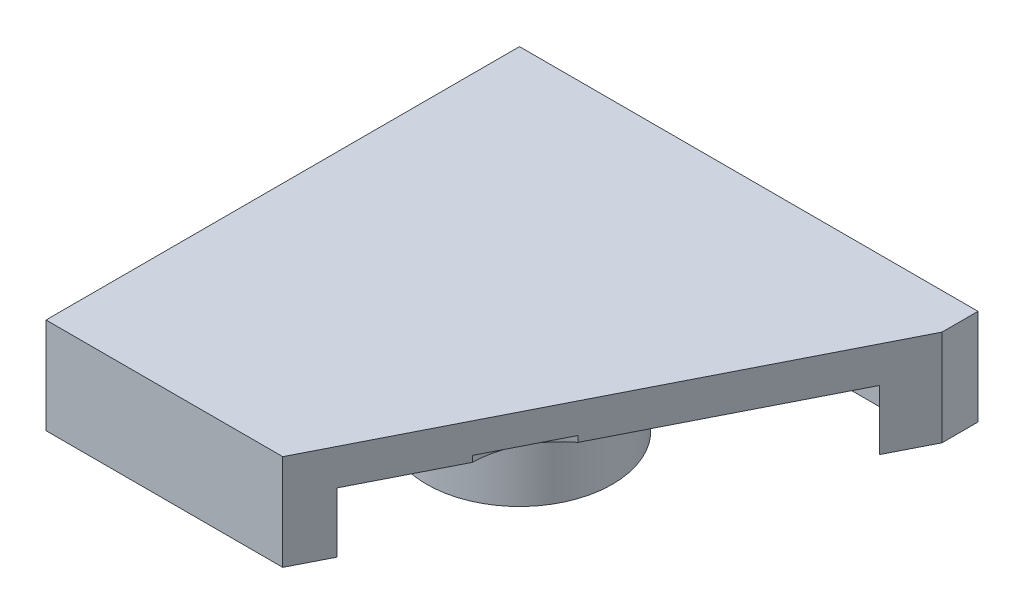
ISO-10303-21;
HEADER;
FILE_DESCRIPTION(('STEP AP214'),'2;1');
FILE_NAME('part.step','',(''),(''),'','','');
FILE_SCHEMA(('AUTOMOTIVE_DESIGN { 1 0 10303 214 1 1 1 1 }'));
ENDSEC;
DATA;
#1=APPLICATION_CONTEXT('core data for automotive mechanical design processes');
#2=APPLICATION_PROTOCOL_DEFINITION('international standard','automotive_design',2000,#1);
#3=PRODUCT_CONTEXT('',#1,'mechanical');
#4=PRODUCT('Part','Part','',(#3));
#5=PRODUCT_RELATED_PRODUCT_CATEGORY('part','',(#4));
#6=PRODUCT_DEFINITION_FORMATION('','',#4);
#7=PRODUCT_DEFINITION_CONTEXT('part definition',#1,'design');
#8=PRODUCT_DEFINITION('design','',#6,#7);
#9=PRODUCT_DEFINITION_SHAPE('','',#8);
#10=(LENGTH_UNIT() NAMED_UNIT(*) SI_UNIT(.MILLI.,.METRE.));
#11=(NAMED_UNIT(*) PLANE_ANGLE_UNIT() SI_UNIT($,.RADIAN.));
#12=(NAMED_UNIT(*) SI_UNIT($,.STERADIAN.) SOLID_ANGLE_UNIT());
#13=UNCERTAINTY_MEASURE_WITH_UNIT(LENGTH_MEASURE(1.E-05),#10,'distance_accuracy_value','');
#14=(GEOMETRIC_REPRESENTATION_CONTEXT(3) GLOBAL_UNCERTAINTY_ASSIGNED_CONTEXT((#13)) GLOBAL_UNIT_ASSIGNED_CONTEXT((#10,
#11,#12)) REPRESENTATION_CONTEXT('',''));
#15=CARTESIAN_POINT('',(0.,0.,0.));
#16=DIRECTION('',(0.,0.,1.));
#17=DIRECTION('',(1.,0.,0.));
#18=AXIS2_PLACEMENT_3D('',#15,#16,#17);
#19=CARTESIAN_POINT('',(0.681967213114738,0.,7.9));
#20=DIRECTION('',(0.,1.,0.));
#21=DIRECTION('',(0.,0.,1.));
#22=AXIS2_PLACEMENT_3D('',#19,#20,#21);
#23=PLANE('',#22);
#24=DIRECTION('',(1.,0.,0.));
#25=VECTOR('',#24,1.);
#26=CARTESIAN_POINT('',(0.681967213114738,0.,-7.9));
#27=LINE('',#26,#25);
#28=CARTESIAN_POINT('',(0.681967213114738,0.,-7.9));
#29=VERTEX_POINT('',#28);
#30=CARTESIAN_POINT('',(15.9819672131147,0.,-7.9));
#31=VERTEX_POINT('',#30);
#32=EDGE_CURVE('E220',#29,#31,#27,.T.);
#33=ORIENTED_EDGE('',*,*,#32,.T.);
#34=DIRECTION('',(0.,0.,-1.));
#35=VECTOR('',#34,1.);
#36=CARTESIAN_POINT('',(15.9819672131147,0.,-6.7));
#37=LINE('',#36,#35);
#38=CARTESIAN_POINT('',(15.9819672131147,0.,-6.7));
#39=VERTEX_POINT('',#38);
#40=EDGE_CURVE('E156',#39,#31,#37,.T.);
#41=ORIENTED_EDGE('',*,*,#40,.F.);
#42=DIRECTION('',(0.452094425934652,0.,-0.8919700836008));
#43=VECTOR('',#42,1.);
#44=CARTESIAN_POINT('',(8.74651880010872,0.,7.57534416620106));
#45=LINE('',#44,#43);
#46=CARTESIAN_POINT('',(15.2819672131147,0.,-5.31891891891892));
#47=VERTEX_POINT('',#46);
#48=EDGE_CURVE('E148',#47,#39,#45,.T.);
#49=ORIENTED_EDGE('',*,*,#48,.F.);
#50=DIRECTION('',(0.,0.,-1.));
#51=VECTOR('',#50,1.);
#52=CARTESIAN_POINT('',(15.2819672131147,0.,7.9));
#53=LINE('',#52,#51);
#54=CARTESIAN_POINT('',(15.2819672131147,0.,-6.7));
#55=VERTEX_POINT('',#54);
#56=EDGE_CURVE('E197',#47,#55,#53,.T.);
#57=ORIENTED_EDGE('',*,*,#56,.T.);
#58=DIRECTION('',(1.,0.,0.));
#59=VECTOR('',#58,1.);
#60=CARTESIAN_POINT('',(0.,0.,-6.7));
#61=LINE('',#60,#59);
#62=CARTESIAN_POINT('',(1.88196721311474,0.,-6.7));
#63=VERTEX_POINT('',#62);
#64=EDGE_CURVE('E183',#63,#55,#61,.T.);
#65=ORIENTED_EDGE('',*,*,#64,.F.);
#66=DIRECTION('',(0.,0.,-1.));
#67=VECTOR('',#66,1.);
#68=CARTESIAN_POINT('',(1.88196721311474,0.,7.9));
#69=LINE('',#68,#67);
#70=CARTESIAN_POINT('',(1.88196721311474,0.,6.7));
#71=VERTEX_POINT('',#70);
#72=EDGE_CURVE('E200',#71,#63,#69,.T.);
#73=ORIENTED_EDGE('',*,*,#72,.F.);
#74=DIRECTION('',(1.,0.,0.));
#75=VECTOR('',#74,1.);
#76=CARTESIAN_POINT('',(0.,0.,6.7));
#77=LINE('',#76,#75);
#78=CARTESIAN_POINT('',(9.19018639119693,0.,6.7));
#79=VERTEX_POINT('',#78);
#80=EDGE_CURVE('E186',#71,#79,#77,.T.);
#81=ORIENTED_EDGE('',*,*,#80,.T.);
#82=CARTESIAN_POINT('',(8.58196721311474,0.,7.9));
#83=VERTEX_POINT('',#82);
#84=EDGE_CURVE('E66',#83,#79,#45,.T.);
#85=ORIENTED_EDGE('',*,*,#84,.F.);
#86=DIRECTION('',(1.,0.,0.));
#87=VECTOR('',#86,1.);
#88=CARTESIAN_POINT('',(0.681967213114738,0.,7.9));
#89=LINE('',#88,#87);
#90=CARTESIAN_POINT('',(0.681967213114738,0.,7.9));
#91=VERTEX_POINT('',#90);
#92=EDGE_CURVE('E211',#91,#83,#89,.T.);
#93=ORIENTED_EDGE('',*,*,#92,.F.);
#94=DIRECTION('',(0.,0.,-1.));
#95=VECTOR('',#94,1.);
#96=CARTESIAN_POINT('',(0.681967213114738,0.,7.9));
#97=LINE('',#96,#95);
#98=EDGE_CURVE('E226',#91,#29,#97,.T.);
#99=ORIENTED_EDGE('',*,*,#98,.T.);
#100=EDGE_LOOP('',(#33,#41,#49,#57,#65,#73,#81,#85,#93,#99));
#101=FACE_BOUND('',#100,.T.);
#102=ADVANCED_FACE('F45',(#101),#23,.F.);
#103=CARTESIAN_POINT('',(0.681967213114738,0.,7.9));
#104=DIRECTION('',(1.,0.,0.));
#105=DIRECTION('',(0.,0.,-1.));
#106=AXIS2_PLACEMENT_3D('',#103,#104,#105);
#107=PLANE('',#106);
#108=DIRECTION('',(0.,-1.,0.));
#109=VECTOR('',#108,1.);
#110=CARTESIAN_POINT('',(0.681967213114738,0.,-7.9));
#111=LINE('',#110,#109);
#112=CARTESIAN_POINT('',(0.681967213114738,3.2,-7.9));
#113=VERTEX_POINT('',#112);
#114=EDGE_CURVE('E202',#113,#29,#111,.T.);
#115=ORIENTED_EDGE('',*,*,#114,.T.);
#116=ORIENTED_EDGE('',*,*,#98,.F.);
#117=DIRECTION('',(0.,-1.,0.));
#118=VECTOR('',#117,1.);
#119=CARTESIAN_POINT('',(0.681967213114738,0.,7.9));
#120=LINE('',#119,#118);
#121=CARTESIAN_POINT('',(0.681967213114738,3.2,7.9));
#122=VERTEX_POINT('',#121);
#123=EDGE_CURVE('E208',#122,#91,#120,.T.);
#124=ORIENTED_EDGE('',*,*,#123,.F.);
#125=DIRECTION('',(0.,0.,-1.));
#126=VECTOR('',#125,1.);
#127=CARTESIAN_POINT('',(0.681967213114738,3.2,7.9));
#128=LINE('',#127,#126);
#129=EDGE_CURVE('E217',#122,#113,#128,.T.);
#130=ORIENTED_EDGE('',*,*,#129,.T.);
#131=EDGE_LOOP('',(#115,#116,#124,#130));
#132=FACE_BOUND('',#131,.T.);
#133=ADVANCED_FACE('F47',(#132),#107,.F.);
#134=CARTESIAN_POINT('',(0.681967213114738,3.2,7.9));
#135=DIRECTION('',(0.,-1.,0.));
#136=DIRECTION('',(1.,0.,0.));
#137=AXIS2_PLACEMENT_3D('',#134,#135,#136);
#138=PLANE('',#137);
#139=DIRECTION('',(0.452094425934655,0.,-0.891970083600798));
#140=VECTOR('',#139,1.);
#141=CARTESIAN_POINT('',(8.74651880010872,3.2,7.57534416620106));
#142=LINE('',#141,#140);
#143=CARTESIAN_POINT('',(8.58196721311474,3.2,7.9));
#144=VERTEX_POINT('',#143);
#145=CARTESIAN_POINT('',(15.9819672131147,3.2,-6.7));
#146=VERTEX_POINT('',#145);
#147=EDGE_CURVE('E152',#144,#146,#142,.T.);
#148=ORIENTED_EDGE('',*,*,#147,.T.);
#149=DIRECTION('',(0.,0.,-1.));
#150=VECTOR('',#149,1.);
#151=CARTESIAN_POINT('',(15.9819672131147,3.2,-6.7));
#152=LINE('',#151,#150);
#153=CARTESIAN_POINT('',(15.9819672131147,3.2,-7.9));
#154=VERTEX_POINT('',#153);
#155=EDGE_CURVE('E155',#146,#154,#152,.T.);
#156=ORIENTED_EDGE('',*,*,#155,.T.);
#157=DIRECTION('',(-1.,0.,0.));
#158=VECTOR('',#157,1.);
#159=CARTESIAN_POINT('',(0.681967213114738,3.2,-7.9));
#160=LINE('',#159,#158);
#161=EDGE_CURVE('E212',#154,#113,#160,.T.);
#162=ORIENTED_EDGE('',*,*,#161,.T.);
#163=ORIENTED_EDGE('',*,*,#129,.F.);
#164=DIRECTION('',(-1.,0.,0.));
#165=VECTOR('',#164,1.);
#166=CARTESIAN_POINT('',(0.681967213114738,3.2,7.9));
#167=LINE('',#166,#165);
#168=EDGE_CURVE('E215',#144,#122,#167,.T.);
#169=ORIENTED_EDGE('',*,*,#168,.F.);
#170=EDGE_LOOP('',(#148,#156,#162,#163,#169));
#171=FACE_BOUND('',#170,.T.);
#172=ADVANCED_FACE('F268',(#171),#138,.F.);
#173=CARTESIAN_POINT('',(0.,0.,7.9));
#174=DIRECTION('',(0.,0.,-1.));
#175=DIRECTION('',(-1.,0.,0.));
#176=AXIS2_PLACEMENT_3D('',#173,#174,#175);
#177=PLANE('',#176);
#178=ORIENTED_EDGE('',*,*,#92,.T.);
#179=DIRECTION('',(0.,-1.,0.));
#180=VECTOR('',#179,1.);
#181=CARTESIAN_POINT('',(8.58196721311474,3.2,7.9));
#182=LINE('',#181,#180);
#183=EDGE_CURVE('E162',#144,#83,#182,.T.);
#184=ORIENTED_EDGE('',*,*,#183,.F.);
#185=ORIENTED_EDGE('',*,*,#168,.T.);
#186=ORIENTED_EDGE('',*,*,#123,.T.);
#187=EDGE_LOOP('',(#178,#184,#185,#186));
#188=FACE_BOUND('',#187,.T.);
#189=ADVANCED_FACE('F273',(#188),#177,.F.);
#190=CARTESIAN_POINT('',(0.,0.,-7.9));
#191=DIRECTION('',(0.,0.,-1.));
#192=DIRECTION('',(-1.,0.,0.));
#193=AXIS2_PLACEMENT_3D('',#190,#191,#192);
#194=PLANE('',#193);
#195=DIRECTION('',(0.,-1.,0.));
#196=VECTOR('',#195,1.);
#197=CARTESIAN_POINT('',(15.9819672131147,3.2,-7.9));
#198=LINE('',#197,#196);
#199=EDGE_CURVE('E165',#154,#31,#198,.T.);
#200=ORIENTED_EDGE('',*,*,#199,.T.);
#201=ORIENTED_EDGE('',*,*,#32,.F.);
#202=ORIENTED_EDGE('',*,*,#114,.F.);
#203=ORIENTED_EDGE('',*,*,#161,.F.);
#204=EDGE_LOOP('',(#200,#201,#202,#203));
#205=FACE_BOUND('',#204,.T.);
#206=ADVANCED_FACE('F275',(#205),#194,.T.);
#207=CARTESIAN_POINT('',(1.88196721311474,0.,7.9));
#208=DIRECTION('',(1.,0.,0.));
#209=DIRECTION('',(0.,0.,-1.));
#210=AXIS2_PLACEMENT_3D('',#207,#208,#209);
#211=PLANE('',#210);
#212=DIRECTION('',(0.,-1.,0.));
#213=VECTOR('',#212,1.);
#214=CARTESIAN_POINT('',(1.88196721311474,0.,-6.7));
#215=LINE('',#214,#213);
#216=CARTESIAN_POINT('',(1.88196721311474,2.,-6.7));
#217=VERTEX_POINT('',#216);
#218=EDGE_CURVE('E180',#217,#63,#215,.T.);
#219=ORIENTED_EDGE('',*,*,#218,.F.);
#220=DIRECTION('',(0.,0.,-1.));
#221=VECTOR('',#220,1.);
#222=CARTESIAN_POINT('',(1.88196721311474,2.,7.9));
#223=LINE('',#222,#221);
#224=CARTESIAN_POINT('',(1.88196721311474,2.,6.7));
#225=VERTEX_POINT('',#224);
#226=EDGE_CURVE('E188',#225,#217,#223,.T.);
#227=ORIENTED_EDGE('',*,*,#226,.F.);
#228=DIRECTION('',(0.,-1.,0.));
#229=VECTOR('',#228,1.);
#230=CARTESIAN_POINT('',(1.88196721311474,0.,6.7));
#231=LINE('',#230,#229);
#232=EDGE_CURVE('E184',#225,#71,#231,.T.);
#233=ORIENTED_EDGE('',*,*,#232,.T.);
#234=ORIENTED_EDGE('',*,*,#72,.T.);
#235=EDGE_LOOP('',(#219,#227,#233,#234));
#236=FACE_BOUND('',#235,.T.);
#237=ADVANCED_FACE('F278',(#236),#211,.T.);
#238=CARTESIAN_POINT('',(15.2819672131147,0.,7.9));
#239=DIRECTION('',(-1.,0.,0.));
#240=DIRECTION('',(0.,0.,1.));
#241=AXIS2_PLACEMENT_3D('',#238,#239,#240);
#242=PLANE('',#241);
#243=DIRECTION('',(0.,-1.,0.));
#244=VECTOR('',#243,1.);
#245=CARTESIAN_POINT('',(15.2819672131147,0.,-5.31891891891892));
#246=LINE('',#245,#244);
#247=CARTESIAN_POINT('',(15.2819672131147,2.,-5.31891891891892));
#248=VERTEX_POINT('',#247);
#249=EDGE_CURVE('E171',#248,#47,#246,.T.);
#250=ORIENTED_EDGE('',*,*,#249,.F.);
#251=DIRECTION('',(0.,0.,-1.));
#252=VECTOR('',#251,1.);
#253=CARTESIAN_POINT('',(15.2819672131147,2.,7.9));
#254=LINE('',#253,#252);
#255=CARTESIAN_POINT('',(15.2819672131147,2.,-6.7));
#256=VERTEX_POINT('',#255);
#257=EDGE_CURVE('E191',#248,#256,#254,.T.);
#258=ORIENTED_EDGE('',*,*,#257,.T.);
#259=DIRECTION('',(0.,1.,0.));
#260=VECTOR('',#259,1.);
#261=CARTESIAN_POINT('',(15.2819672131147,0.,-6.7));
#262=LINE('',#261,#260);
#263=EDGE_CURVE('E194',#55,#256,#262,.T.);
#264=ORIENTED_EDGE('',*,*,#263,.F.);
#265=ORIENTED_EDGE('',*,*,#56,.F.);
#266=EDGE_LOOP('',(#250,#258,#264,#265));
#267=FACE_BOUND('',#266,.T.);
#268=ADVANCED_FACE('F291',(#267),#242,.T.);
#269=CARTESIAN_POINT('',(0.681967213114738,2.,7.9));
#270=DIRECTION('',(0.,-1.,0.));
#271=DIRECTION('',(1.,0.,0.));
#272=AXIS2_PLACEMENT_3D('',#269,#270,#271);
#273=PLANE('',#272);
#274=CARTESIAN_POINT('',(13.7107424714246,2.,3.74883214762885));
#275=DIRECTION('',(0.,-1.,0.));
#276=DIRECTION('',(1.,0.,0.));
#277=AXIS2_PLACEMENT_3D('',#274,#275,#276);
#278=CIRCLE('',#277,3.);
#279=CARTESIAN_POINT('',(10.7111535048734,2.,3.69917299193567));
#280=VERTEX_POINT('',#279);
#281=CARTESIAN_POINT('',(11.8972711267549,2.,1.35899498119637));
#282=VERTEX_POINT('',#281);
#283=EDGE_CURVE('E146',#280,#282,#278,.T.);
#284=ORIENTED_EDGE('',*,*,#283,.F.);
#285=DIRECTION('',(0.452094425934652,0.,-0.8919700836008));
#286=VECTOR('',#285,1.);
#287=CARTESIAN_POINT('',(6.9672911904214,2.,11.0857121528815));
#288=LINE('',#287,#286);
#289=CARTESIAN_POINT('',(9.19018639119693,2.,6.7));
#290=VERTEX_POINT('',#289);
#291=EDGE_CURVE('E145',#290,#280,#288,.T.);
#292=ORIENTED_EDGE('',*,*,#291,.F.);
#293=DIRECTION('',(-1.,0.,0.));
#294=VECTOR('',#293,1.);
#295=CARTESIAN_POINT('',(0.,2.,6.7));
#296=LINE('',#295,#294);
#297=EDGE_CURVE('E192',#290,#225,#296,.T.);
#298=ORIENTED_EDGE('',*,*,#297,.T.);
#299=ORIENTED_EDGE('',*,*,#226,.T.);
#300=DIRECTION('',(-1.,0.,0.));
#301=VECTOR('',#300,1.);
#302=CARTESIAN_POINT('',(0.,2.,-6.7));
#303=LINE('',#302,#301);
#304=EDGE_CURVE('E187',#256,#217,#303,.T.);
#305=ORIENTED_EDGE('',*,*,#304,.F.);
#306=ORIENTED_EDGE('',*,*,#257,.F.);
#307=EDGE_CURVE('E164',#282,#248,#288,.T.);
#308=ORIENTED_EDGE('',*,*,#307,.F.);
#309=EDGE_LOOP('',(#284,#292,#298,#299,#305,#306,#308));
#310=FACE_BOUND('',#309,.T.);
#311=CARTESIAN_POINT('',(8.58196721311474,2.,0.));
#312=DIRECTION('',(0.,-1.,0.));
#313=DIRECTION('',(1.,0.,0.));
#314=AXIS2_PLACEMENT_3D('',#311,#312,#313);
#315=CIRCLE('',#314,3.1);
#316=CARTESIAN_POINT('',(11.6819672131147,2.,0.));
#317=VERTEX_POINT('',#316);
#318=EDGE_CURVE('E179',#317,#317,#315,.F.);
#319=ORIENTED_EDGE('',*,*,#318,.T.);
#320=EDGE_LOOP('',(#319));
#321=FACE_BOUND('',#320,.T.);
#322=ADVANCED_FACE('F233',(#310,#321),#273,.T.);
#323=CARTESIAN_POINT('',(0.,0.,6.7));
#324=DIRECTION('',(0.,0.,-1.));
#325=DIRECTION('',(-1.,0.,0.));
#326=AXIS2_PLACEMENT_3D('',#323,#324,#325);
#327=PLANE('',#326);
#328=DIRECTION('',(0.,1.,0.));
#329=VECTOR('',#328,1.);
#330=CARTESIAN_POINT('',(9.19018639119693,0.,6.7));
#331=LINE('',#330,#329);
#332=EDGE_CURVE('E11',#79,#290,#331,.T.);
#333=ORIENTED_EDGE('',*,*,#332,.F.);
#334=ORIENTED_EDGE('',*,*,#80,.F.);
#335=ORIENTED_EDGE('',*,*,#232,.F.);
#336=ORIENTED_EDGE('',*,*,#297,.F.);
#337=EDGE_LOOP('',(#333,#334,#335,#336));
#338=FACE_BOUND('',#337,.T.);
#339=ADVANCED_FACE('F285',(#338),#327,.T.);
#340=CARTESIAN_POINT('',(0.,0.,-6.7));
#341=DIRECTION('',(0.,0.,-1.));
#342=DIRECTION('',(-1.,0.,0.));
#343=AXIS2_PLACEMENT_3D('',#340,#341,#342);
#344=PLANE('',#343);
#345=ORIENTED_EDGE('',*,*,#218,.T.);
#346=ORIENTED_EDGE('',*,*,#64,.T.);
#347=ORIENTED_EDGE('',*,*,#263,.T.);
#348=ORIENTED_EDGE('',*,*,#304,.T.);
#349=EDGE_LOOP('',(#345,#346,#347,#348));
#350=FACE_BOUND('',#349,.T.);
#351=ADVANCED_FACE('F245',(#350),#344,.F.);
#352=CARTESIAN_POINT('',(8.58196721311474,0.,0.));
#353=DIRECTION('',(0.,-1.,0.));
#354=DIRECTION('',(0.,0.,-1.));
#355=AXIS2_PLACEMENT_3D('',#352,#353,#354);
#356=PLANE('',#355);
#357=CARTESIAN_POINT('',(8.58196721311474,0.,0.));
#358=DIRECTION('',(0.,-1.,0.));
#359=DIRECTION('',(0.,0.,-1.));
#360=AXIS2_PLACEMENT_3D('',#357,#358,#359);
#361=CIRCLE('',#360,3.1);
#362=CARTESIAN_POINT('',(8.58196721311474,0.,-3.1));
#363=VERTEX_POINT('',#362);
#364=EDGE_CURVE('E176',#363,#363,#361,.T.);
#365=ORIENTED_EDGE('',*,*,#364,.T.);
#366=EDGE_LOOP('',(#365));
#367=FACE_BOUND('',#366,.T.);
#368=CARTESIAN_POINT('',(8.58196721311474,0.,0.));
#369=DIRECTION('',(0.,-1.,0.));
#370=DIRECTION('',(0.,0.,-1.));
#371=AXIS2_PLACEMENT_3D('',#368,#369,#370);
#372=CIRCLE('',#371,2.4);
#373=CARTESIAN_POINT('',(8.58196721311474,0.,-2.4));
#374=VERTEX_POINT('',#373);
#375=EDGE_CURVE('E173',#374,#374,#372,.T.);
#376=ORIENTED_EDGE('',*,*,#375,.F.);
#377=EDGE_LOOP('',(#376));
#378=FACE_BOUND('',#377,.T.);
#379=ADVANCED_FACE('F239',(#367,#378),#356,.T.);
#380=CARTESIAN_POINT('',(8.58196721311474,0.,0.));
#381=DIRECTION('',(0.,1.,0.));
#382=DIRECTION('',(0.,0.,1.));
#383=AXIS2_PLACEMENT_3D('',#380,#381,#382);
#384=CYLINDRICAL_SURFACE('',#383,3.1);
#385=ORIENTED_EDGE('',*,*,#318,.F.);
#386=EDGE_LOOP('',(#385));
#387=FACE_BOUND('',#386,.T.);
#388=ORIENTED_EDGE('',*,*,#364,.F.);
#389=EDGE_LOOP('',(#388));
#390=FACE_BOUND('',#389,.T.);
#391=ADVANCED_FACE('F235',(#387,#390),#384,.T.);
#392=CARTESIAN_POINT('',(8.58196721311474,0.,0.));
#393=DIRECTION('',(0.,1.,0.));
#394=DIRECTION('',(0.,0.,1.));
#395=AXIS2_PLACEMENT_3D('',#392,#393,#394);
#396=CYLINDRICAL_SURFACE('',#395,2.4);
#397=CARTESIAN_POINT('',(8.58196721311474,2.,0.));
#398=DIRECTION('',(0.,-1.,0.));
#399=DIRECTION('',(1.,0.,0.));
#400=AXIS2_PLACEMENT_3D('',#397,#398,#399);
#401=CIRCLE('',#400,2.4);
#402=CARTESIAN_POINT('',(10.9819672131147,2.,0.));
#403=VERTEX_POINT('',#402);
#404=EDGE_CURVE('E53',#403,#403,#401,.F.);
#405=ORIENTED_EDGE('',*,*,#404,.T.);
#406=EDGE_LOOP('',(#405));
#407=FACE_BOUND('',#406,.T.);
#408=ORIENTED_EDGE('',*,*,#375,.T.);
#409=EDGE_LOOP('',(#408));
#410=FACE_BOUND('',#409,.T.);
#411=ADVANCED_FACE('F238',(#407,#410),#396,.F.);
#412=ORIENTED_EDGE('',*,*,#404,.F.);
#413=EDGE_LOOP('',(#412));
#414=FACE_BOUND('',#413,.T.);
#415=ADVANCED_FACE('F250',(#414),#273,.T.);
#416=CARTESIAN_POINT('',(15.9819672131147,3.2,-6.7));
#417=DIRECTION('',(-1.,0.,0.));
#418=DIRECTION('',(0.,0.,1.));
#419=AXIS2_PLACEMENT_3D('',#416,#417,#418);
#420=PLANE('',#419);
#421=ORIENTED_EDGE('',*,*,#40,.T.);
#422=ORIENTED_EDGE('',*,*,#199,.F.);
#423=ORIENTED_EDGE('',*,*,#155,.F.);
#424=DIRECTION('',(0.,-1.,0.));
#425=VECTOR('',#424,1.);
#426=CARTESIAN_POINT('',(15.9819672131147,3.2,-6.7));
#427=LINE('',#426,#425);
#428=EDGE_CURVE('E159',#146,#39,#427,.T.);
#429=ORIENTED_EDGE('',*,*,#428,.T.);
#430=EDGE_LOOP('',(#421,#422,#423,#429));
#431=FACE_BOUND('',#430,.T.);
#432=ADVANCED_FACE('F257',(#431),#420,.F.);
#433=CARTESIAN_POINT('',(8.74651880010872,3.2,7.57534416620106));
#434=DIRECTION('',(-0.8919700836008,0.,-0.452094425934652));
#435=DIRECTION('',(-0.452094425934652,0.,0.8919700836008));
#436=AXIS2_PLACEMENT_3D('',#433,#434,#435);
#437=PLANE('',#436);
#438=DIRECTION('',(-0.452094425934652,0.,0.8919700836008));
#439=VECTOR('',#438,1.);
#440=CARTESIAN_POINT('',(10.7111535048734,2.2,3.69917299193567));
#441=LINE('',#440,#439);
#442=CARTESIAN_POINT('',(11.8972711267549,2.2,1.35899498119637));
#443=VERTEX_POINT('',#442);
#444=CARTESIAN_POINT('',(10.7111535048734,2.2,3.69917299193567));
#445=VERTEX_POINT('',#444);
#446=EDGE_CURVE('E138',#443,#445,#441,.T.);
#447=ORIENTED_EDGE('',*,*,#446,.F.);
#448=DIRECTION('',(0.,-1.,0.));
#449=VECTOR('',#448,1.);
#450=CARTESIAN_POINT('',(11.8972711267549,2.2,1.35899498119637));
#451=LINE('',#450,#449);
#452=EDGE_CURVE('E136',#443,#282,#451,.T.);
#453=ORIENTED_EDGE('',*,*,#452,.T.);
#454=ORIENTED_EDGE('',*,*,#307,.T.);
#455=ORIENTED_EDGE('',*,*,#249,.T.);
#456=ORIENTED_EDGE('',*,*,#48,.T.);
#457=ORIENTED_EDGE('',*,*,#428,.F.);
#458=ORIENTED_EDGE('',*,*,#147,.F.);
#459=ORIENTED_EDGE('',*,*,#183,.T.);
#460=ORIENTED_EDGE('',*,*,#84,.T.);
#461=ORIENTED_EDGE('',*,*,#332,.T.);
#462=ORIENTED_EDGE('',*,*,#291,.T.);
#463=DIRECTION('',(0.,-1.,0.));
#464=VECTOR('',#463,1.);
#465=CARTESIAN_POINT('',(10.7111535048734,2.2,3.69917299193567));
#466=LINE('',#465,#464);
#467=EDGE_CURVE('E133',#445,#280,#466,.T.);
#468=ORIENTED_EDGE('',*,*,#467,.F.);
#469=EDGE_LOOP('',(#447,#453,#454,#455,#456,#457,#458,#459,#460,#461,#462,#468));
#470=FACE_BOUND('',#469,.T.);
#471=ADVANCED_FACE('F143',(#470),#437,.F.);
#472=CARTESIAN_POINT('',(13.7107424714246,2.2,3.74883214762885));
#473=DIRECTION('',(0.,-1.,0.));
#474=DIRECTION('',(0.,0.,-1.));
#475=AXIS2_PLACEMENT_3D('',#472,#473,#474);
#476=CYLINDRICAL_SURFACE('',#475,3.);
#477=ORIENTED_EDGE('',*,*,#283,.T.);
#478=ORIENTED_EDGE('',*,*,#452,.F.);
#479=CARTESIAN_POINT('',(13.7107424714246,2.2,3.74883214762885));
#480=DIRECTION('',(0.,-1.,0.));
#481=DIRECTION('',(0.,0.,1.));
#482=AXIS2_PLACEMENT_3D('',#479,#480,#481);
#483=CIRCLE('',#482,3.);
#484=EDGE_CURVE('E59',#445,#443,#483,.T.);
#485=ORIENTED_EDGE('',*,*,#484,.F.);
#486=ORIENTED_EDGE('',*,*,#467,.T.);
#487=EDGE_LOOP('',(#477,#478,#485,#486));
#488=FACE_BOUND('',#487,.T.);
#489=ADVANCED_FACE('F131',(#488),#476,.F.);
#490=CARTESIAN_POINT('',(13.7107424714246,2.2,3.74883214762885));
#491=DIRECTION('',(0.,1.,0.));
#492=DIRECTION('',(0.,0.,1.));
#493=AXIS2_PLACEMENT_3D('',#490,#491,#492);
#494=PLANE('',#493);
#495=ORIENTED_EDGE('',*,*,#484,.T.);
#496=ORIENTED_EDGE('',*,*,#446,.T.);
#497=EDGE_LOOP('',(#495,#496));
#498=FACE_BOUND('',#497,.T.);
#499=ADVANCED_FACE('F140',(#498),#494,.F.);
#500=CLOSED_SHELL('',(#102,#133,#172,#189,#206,#237,#268,#322,#339,#351,#379,#391,#411,#415,
#432,#471,#489,#499));
#501=MANIFOLD_SOLID_BREP('B2',#500);
#502=ADVANCED_BREP_SHAPE_REPRESENTATION('',(#18,#501),#14);
#503=SHAPE_DEFINITION_REPRESENTATION(#9,#502);
ENDSEC;
END-ISO-10303-21;
